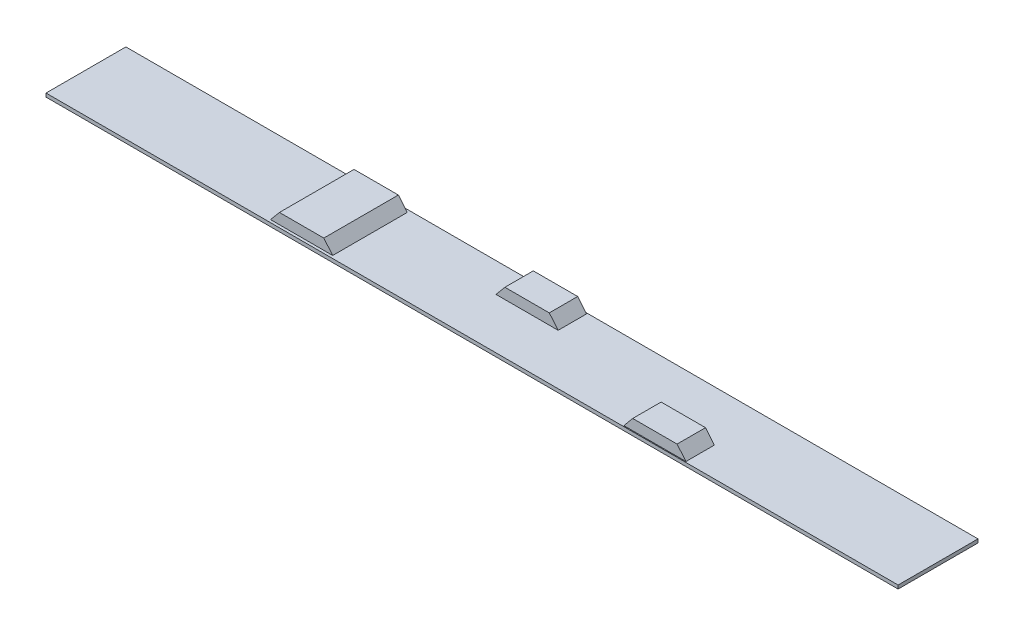
ISO-10303-21;
HEADER;
FILE_DESCRIPTION(('STEP AP214'),'2;1');
FILE_NAME('part.step','',(''),(''),'','','');
FILE_SCHEMA(('AUTOMOTIVE_DESIGN { 1 0 10303 214 1 1 1 1 }'));
ENDSEC;
DATA;
#1=APPLICATION_CONTEXT('core data for automotive mechanical design processes');
#2=APPLICATION_PROTOCOL_DEFINITION('international standard','automotive_design',2000,#1);
#3=PRODUCT_CONTEXT('',#1,'mechanical');
#4=PRODUCT('Part','Part','',(#3));
#5=PRODUCT_RELATED_PRODUCT_CATEGORY('part','',(#4));
#6=PRODUCT_DEFINITION_FORMATION('','',#4);
#7=PRODUCT_DEFINITION_CONTEXT('part definition',#1,'design');
#8=PRODUCT_DEFINITION('design','',#6,#7);
#9=PRODUCT_DEFINITION_SHAPE('','',#8);
#10=(LENGTH_UNIT() NAMED_UNIT(*) SI_UNIT(.MILLI.,.METRE.));
#11=(NAMED_UNIT(*) PLANE_ANGLE_UNIT() SI_UNIT($,.RADIAN.));
#12=(NAMED_UNIT(*) SI_UNIT($,.STERADIAN.) SOLID_ANGLE_UNIT());
#13=UNCERTAINTY_MEASURE_WITH_UNIT(LENGTH_MEASURE(1.E-05),#10,'distance_accuracy_value','');
#14=(GEOMETRIC_REPRESENTATION_CONTEXT(3) GLOBAL_UNCERTAINTY_ASSIGNED_CONTEXT((#13)) GLOBAL_UNIT_ASSIGNED_CONTEXT((#10,
#11,#12)) REPRESENTATION_CONTEXT('',''));
#15=CARTESIAN_POINT('',(0.,0.,0.));
#16=DIRECTION('',(0.,0.,1.));
#17=DIRECTION('',(1.,0.,0.));
#18=AXIS2_PLACEMENT_3D('',#15,#16,#17);
#19=CARTESIAN_POINT('',(0.,10.,0.));
#20=DIRECTION('',(0.,-1.,0.));
#21=DIRECTION('',(0.,0.,-1.));
#22=AXIS2_PLACEMENT_3D('',#19,#20,#21);
#23=PLANE('',#22);
#24=DIRECTION('',(1.,0.,0.));
#25=VECTOR('',#24,1.);
#26=CARTESIAN_POINT('',(425.,10.,110.));
#27=LINE('',#26,#25);
#28=CARTESIAN_POINT('',(425.,10.,110.));
#29=VERTEX_POINT('',#28);
#30=CARTESIAN_POINT('',(600.,10.0000000000001,110.));
#31=VERTEX_POINT('',#30);
#32=EDGE_CURVE('E214',#29,#31,#27,.T.);
#33=ORIENTED_EDGE('',*,*,#32,.F.);
#34=DIRECTION('',(0.,0.,-1.));
#35=VECTOR('',#34,1.);
#36=CARTESIAN_POINT('',(425.,10.,110.));
#37=LINE('',#36,#35);
#38=CARTESIAN_POINT('',(425.,10.,30.));
#39=VERTEX_POINT('',#38);
#40=EDGE_CURVE('E224',#29,#39,#37,.T.);
#41=ORIENTED_EDGE('',*,*,#40,.T.);
#42=DIRECTION('',(1.,0.,0.));
#43=VECTOR('',#42,1.);
#44=CARTESIAN_POINT('',(425.,10.,30.));
#45=LINE('',#44,#43);
#46=CARTESIAN_POINT('',(600.,10.,30.));
#47=VERTEX_POINT('',#46);
#48=EDGE_CURVE('E213',#39,#47,#45,.T.);
#49=ORIENTED_EDGE('',*,*,#48,.T.);
#50=DIRECTION('',(0.,0.,-1.));
#51=VECTOR('',#50,1.);
#52=CARTESIAN_POINT('',(600.,10.0000000000001,110.));
#53=LINE('',#52,#51);
#54=EDGE_CURVE('E240',#31,#47,#53,.T.);
#55=ORIENTED_EDGE('',*,*,#54,.F.);
#56=EDGE_LOOP('',(#33,#41,#49,#55));
#57=FACE_BOUND('',#56,.T.);
#58=DIRECTION('',(0.,0.,-1.));
#59=VECTOR('',#58,1.);
#60=CARTESIAN_POINT('',(1200.,10.,112.5));
#61=LINE('',#60,#59);
#62=CARTESIAN_POINT('',(1200.,10.,112.5));
#63=VERTEX_POINT('',#62);
#64=CARTESIAN_POINT('',(1200.,10.,-112.5));
#65=VERTEX_POINT('',#64);
#66=EDGE_CURVE('E243',#63,#65,#61,.T.);
#67=ORIENTED_EDGE('',*,*,#66,.T.);
#68=DIRECTION('',(-1.,0.,0.));
#69=VECTOR('',#68,1.);
#70=CARTESIAN_POINT('',(-1200.,10.,-112.5));
#71=LINE('',#70,#69);
#72=CARTESIAN_POINT('',(-1200.,10.,-112.5));
#73=VERTEX_POINT('',#72);
#74=EDGE_CURVE('E246',#65,#73,#71,.T.);
#75=ORIENTED_EDGE('',*,*,#74,.T.);
#76=DIRECTION('',(0.,0.,1.));
#77=VECTOR('',#76,1.);
#78=CARTESIAN_POINT('',(-1200.,10.,112.5));
#79=LINE('',#78,#77);
#80=CARTESIAN_POINT('',(-1200.,10.,112.5));
#81=VERTEX_POINT('',#80);
#82=EDGE_CURVE('E249',#73,#81,#79,.T.);
#83=ORIENTED_EDGE('',*,*,#82,.T.);
#84=DIRECTION('',(1.,0.,0.));
#85=VECTOR('',#84,1.);
#86=CARTESIAN_POINT('',(-1200.,10.,112.5));
#87=LINE('',#86,#85);
#88=EDGE_CURVE('E251',#81,#63,#87,.T.);
#89=ORIENTED_EDGE('',*,*,#88,.T.);
#90=EDGE_LOOP('',(#67,#75,#83,#89));
#91=FACE_BOUND('',#90,.T.);
#92=DIRECTION('',(0.,0.,-1.));
#93=VECTOR('',#92,1.);
#94=CARTESIAN_POINT('',(99.9999999999999,9.99999999999662,-30.));
#95=LINE('',#94,#93);
#96=CARTESIAN_POINT('',(99.999999999997,10.,-30.));
#97=VERTEX_POINT('',#96);
#98=CARTESIAN_POINT('',(99.9999999999999,10.,-110.));
#99=VERTEX_POINT('',#98);
#100=EDGE_CURVE('E56',#97,#99,#95,.T.);
#101=ORIENTED_EDGE('',*,*,#100,.F.);
#102=DIRECTION('',(1.,0.,0.));
#103=VECTOR('',#102,1.);
#104=CARTESIAN_POINT('',(-75.0000000000001,9.99999999999653,-30.));
#105=LINE('',#104,#103);
#106=CARTESIAN_POINT('',(-74.9999999999972,10.,-30.));
#107=VERTEX_POINT('',#106);
#108=EDGE_CURVE('E186',#107,#97,#105,.T.);
#109=ORIENTED_EDGE('',*,*,#108,.F.);
#110=DIRECTION('',(0.,0.,-1.));
#111=VECTOR('',#110,1.);
#112=CARTESIAN_POINT('',(-75.0000000000001,9.99999999999653,-30.));
#113=LINE('',#112,#111);
#114=CARTESIAN_POINT('',(-75.0000000000001,9.99999999999653,-110.));
#115=VERTEX_POINT('',#114);
#116=EDGE_CURVE('E197',#107,#115,#113,.T.);
#117=ORIENTED_EDGE('',*,*,#116,.T.);
#118=DIRECTION('',(1.,0.,0.));
#119=VECTOR('',#118,1.);
#120=CARTESIAN_POINT('',(-75.0000000000001,9.99999999999653,-110.));
#121=LINE('',#120,#119);
#122=EDGE_CURVE('E181',#115,#99,#121,.T.);
#123=ORIENTED_EDGE('',*,*,#122,.T.);
#124=EDGE_LOOP('',(#101,#109,#117,#123));
#125=FACE_BOUND('',#124,.T.);
#126=DIRECTION('',(1.,0.,0.));
#127=VECTOR('',#126,1.);
#128=CARTESIAN_POINT('',(-575.,9.99999999999304,-105.));
#129=LINE('',#128,#127);
#130=CARTESIAN_POINT('',(-575.,9.99999999999304,-105.));
#131=VERTEX_POINT('',#130);
#132=CARTESIAN_POINT('',(-400.,9.99999999999313,-105.));
#133=VERTEX_POINT('',#132);
#134=EDGE_CURVE('E174',#131,#133,#129,.T.);
#135=ORIENTED_EDGE('',*,*,#134,.T.);
#136=DIRECTION('',(0.,0.,1.));
#137=VECTOR('',#136,1.);
#138=CARTESIAN_POINT('',(-400.,9.99999999999313,-105.));
#139=LINE('',#138,#137);
#140=CARTESIAN_POINT('',(-400.,9.99999999999313,105.));
#141=VERTEX_POINT('',#140);
#142=EDGE_CURVE('E182',#133,#141,#139,.T.);
#143=ORIENTED_EDGE('',*,*,#142,.T.);
#144=DIRECTION('',(1.,0.,0.));
#145=VECTOR('',#144,1.);
#146=CARTESIAN_POINT('',(-575.,9.99999999999304,105.));
#147=LINE('',#146,#145);
#148=CARTESIAN_POINT('',(-575.,10.,105.));
#149=VERTEX_POINT('',#148);
#150=EDGE_CURVE('E161',#149,#141,#147,.T.);
#151=ORIENTED_EDGE('',*,*,#150,.F.);
#152=DIRECTION('',(0.,0.,1.));
#153=VECTOR('',#152,1.);
#154=CARTESIAN_POINT('',(-575.,9.99999999999304,-105.));
#155=LINE('',#154,#153);
#156=EDGE_CURVE('E155',#131,#149,#155,.T.);
#157=ORIENTED_EDGE('',*,*,#156,.F.);
#158=EDGE_LOOP('',(#135,#143,#151,#157));
#159=FACE_BOUND('',#158,.T.);
#160=ADVANCED_FACE('F33',(#57,#91,#125,#159),#23,.F.);
#161=CARTESIAN_POINT('',(1200.,10.,112.5));
#162=DIRECTION('',(-1.,0.,0.));
#163=DIRECTION('',(0.,0.,1.));
#164=AXIS2_PLACEMENT_3D('',#161,#162,#163);
#165=PLANE('',#164);
#166=DIRECTION('',(0.,0.,-1.));
#167=VECTOR('',#166,1.);
#168=CARTESIAN_POINT('',(1200.,0.,112.5));
#169=LINE('',#168,#167);
#170=CARTESIAN_POINT('',(1200.,0.,112.5));
#171=VERTEX_POINT('',#170);
#172=CARTESIAN_POINT('',(1200.,0.,-112.5));
#173=VERTEX_POINT('',#172);
#174=EDGE_CURVE('E242',#171,#173,#169,.T.);
#175=ORIENTED_EDGE('',*,*,#174,.T.);
#176=DIRECTION('',(0.,-1.,0.));
#177=VECTOR('',#176,1.);
#178=CARTESIAN_POINT('',(1200.,10.,-112.5));
#179=LINE('',#178,#177);
#180=EDGE_CURVE('E11',#65,#173,#179,.T.);
#181=ORIENTED_EDGE('',*,*,#180,.F.);
#182=ORIENTED_EDGE('',*,*,#66,.F.);
#183=DIRECTION('',(0.,-1.,0.));
#184=VECTOR('',#183,1.);
#185=CARTESIAN_POINT('',(1200.,10.,112.5));
#186=LINE('',#185,#184);
#187=EDGE_CURVE('E253',#63,#171,#186,.T.);
#188=ORIENTED_EDGE('',*,*,#187,.T.);
#189=EDGE_LOOP('',(#175,#181,#182,#188));
#190=FACE_BOUND('',#189,.T.);
#191=ADVANCED_FACE('F35',(#190),#165,.F.);
#192=CARTESIAN_POINT('',(-1200.,10.,-112.5));
#193=DIRECTION('',(0.,0.,1.));
#194=DIRECTION('',(1.,0.,0.));
#195=AXIS2_PLACEMENT_3D('',#192,#193,#194);
#196=PLANE('',#195);
#197=DIRECTION('',(-1.,0.,0.));
#198=VECTOR('',#197,1.);
#199=CARTESIAN_POINT('',(-1200.,0.,-112.5));
#200=LINE('',#199,#198);
#201=CARTESIAN_POINT('',(-1200.,0.,-112.5));
#202=VERTEX_POINT('',#201);
#203=EDGE_CURVE('E256',#173,#202,#200,.T.);
#204=ORIENTED_EDGE('',*,*,#203,.T.);
#205=DIRECTION('',(0.,-1.,0.));
#206=VECTOR('',#205,1.);
#207=CARTESIAN_POINT('',(-1200.,10.,-112.5));
#208=LINE('',#207,#206);
#209=EDGE_CURVE('E41',#73,#202,#208,.T.);
#210=ORIENTED_EDGE('',*,*,#209,.F.);
#211=ORIENTED_EDGE('',*,*,#74,.F.);
#212=ORIENTED_EDGE('',*,*,#180,.T.);
#213=EDGE_LOOP('',(#204,#210,#211,#212));
#214=FACE_BOUND('',#213,.T.);
#215=ADVANCED_FACE('F285',(#214),#196,.F.);
#216=CARTESIAN_POINT('',(-1200.,10.,112.5));
#217=DIRECTION('',(1.,0.,0.));
#218=DIRECTION('',(0.,0.,-1.));
#219=AXIS2_PLACEMENT_3D('',#216,#217,#218);
#220=PLANE('',#219);
#221=DIRECTION('',(0.,0.,1.));
#222=VECTOR('',#221,1.);
#223=CARTESIAN_POINT('',(-1200.,0.,112.5));
#224=LINE('',#223,#222);
#225=CARTESIAN_POINT('',(-1200.,0.,112.5));
#226=VERTEX_POINT('',#225);
#227=EDGE_CURVE('E258',#202,#226,#224,.T.);
#228=ORIENTED_EDGE('',*,*,#227,.T.);
#229=DIRECTION('',(0.,-1.,0.));
#230=VECTOR('',#229,1.);
#231=CARTESIAN_POINT('',(-1200.,10.,112.5));
#232=LINE('',#231,#230);
#233=EDGE_CURVE('E263',#81,#226,#232,.T.);
#234=ORIENTED_EDGE('',*,*,#233,.F.);
#235=ORIENTED_EDGE('',*,*,#82,.F.);
#236=ORIENTED_EDGE('',*,*,#209,.T.);
#237=EDGE_LOOP('',(#228,#234,#235,#236));
#238=FACE_BOUND('',#237,.T.);
#239=ADVANCED_FACE('F270',(#238),#220,.F.);
#240=CARTESIAN_POINT('',(-1200.,10.,112.5));
#241=DIRECTION('',(0.,0.,-1.));
#242=DIRECTION('',(-1.,0.,0.));
#243=AXIS2_PLACEMENT_3D('',#240,#241,#242);
#244=PLANE('',#243);
#245=DIRECTION('',(1.,0.,0.));
#246=VECTOR('',#245,1.);
#247=CARTESIAN_POINT('',(-1200.,0.,112.5));
#248=LINE('',#247,#246);
#249=EDGE_CURVE('E247',#226,#171,#248,.T.);
#250=ORIENTED_EDGE('',*,*,#249,.T.);
#251=ORIENTED_EDGE('',*,*,#187,.F.);
#252=ORIENTED_EDGE('',*,*,#88,.F.);
#253=ORIENTED_EDGE('',*,*,#233,.T.);
#254=EDGE_LOOP('',(#250,#251,#252,#253));
#255=FACE_BOUND('',#254,.T.);
#256=ADVANCED_FACE('F279',(#255),#244,.F.);
#257=CARTESIAN_POINT('',(0.,0.,0.));
#258=DIRECTION('',(0.,-1.,0.));
#259=DIRECTION('',(0.,0.,-1.));
#260=AXIS2_PLACEMENT_3D('',#257,#258,#259);
#261=PLANE('',#260);
#262=ORIENTED_EDGE('',*,*,#174,.F.);
#263=ORIENTED_EDGE('',*,*,#249,.F.);
#264=ORIENTED_EDGE('',*,*,#227,.F.);
#265=ORIENTED_EDGE('',*,*,#203,.F.);
#266=EDGE_LOOP('',(#262,#263,#264,#265));
#267=FACE_BOUND('',#266,.T.);
#268=ADVANCED_FACE('F276',(#267),#261,.T.);
#269=CARTESIAN_POINT('',(575.,40.0000000000001,110.));
#270=DIRECTION('',(-0.768221279597375,-0.64018439966448,0.));
#271=DIRECTION('',(0.64018439966448,-0.768221279597375,0.));
#272=AXIS2_PLACEMENT_3D('',#269,#270,#271);
#273=PLANE('',#272);
#274=DIRECTION('',(-0.64018439966448,0.768221279597375,0.));
#275=VECTOR('',#274,1.);
#276=CARTESIAN_POINT('',(575.,40.0000000000001,30.));
#277=LINE('',#276,#275);
#278=CARTESIAN_POINT('',(575.,40.0000000000001,30.));
#279=VERTEX_POINT('',#278);
#280=EDGE_CURVE('E227',#47,#279,#277,.T.);
#281=ORIENTED_EDGE('',*,*,#280,.T.);
#282=DIRECTION('',(0.,0.,-1.));
#283=VECTOR('',#282,1.);
#284=CARTESIAN_POINT('',(575.,40.0000000000001,110.));
#285=LINE('',#284,#283);
#286=CARTESIAN_POINT('',(575.,40.0000000000001,110.));
#287=VERTEX_POINT('',#286);
#288=EDGE_CURVE('E237',#287,#279,#285,.T.);
#289=ORIENTED_EDGE('',*,*,#288,.F.);
#290=DIRECTION('',(-0.64018439966448,0.768221279597375,0.));
#291=VECTOR('',#290,1.);
#292=CARTESIAN_POINT('',(575.,40.0000000000001,110.));
#293=LINE('',#292,#291);
#294=EDGE_CURVE('E217',#31,#287,#293,.T.);
#295=ORIENTED_EDGE('',*,*,#294,.F.);
#296=ORIENTED_EDGE('',*,*,#54,.T.);
#297=EDGE_LOOP('',(#281,#289,#295,#296));
#298=FACE_BOUND('',#297,.T.);
#299=ADVANCED_FACE('F300',(#298),#273,.F.);
#300=CARTESIAN_POINT('',(450.,40.0000000000001,110.));
#301=DIRECTION('',(0.,-1.,0.));
#302=DIRECTION('',(0.,0.,-1.));
#303=AXIS2_PLACEMENT_3D('',#300,#301,#302);
#304=PLANE('',#303);
#305=DIRECTION('',(-1.,0.,0.));
#306=VECTOR('',#305,1.);
#307=CARTESIAN_POINT('',(450.,40.0000000000001,30.));
#308=LINE('',#307,#306);
#309=CARTESIAN_POINT('',(450.,40.0000000000001,30.));
#310=VERTEX_POINT('',#309);
#311=EDGE_CURVE('E229',#279,#310,#308,.T.);
#312=ORIENTED_EDGE('',*,*,#311,.T.);
#313=DIRECTION('',(0.,0.,-1.));
#314=VECTOR('',#313,1.);
#315=CARTESIAN_POINT('',(450.,40.0000000000001,110.));
#316=LINE('',#315,#314);
#317=CARTESIAN_POINT('',(450.,40.0000000000001,110.));
#318=VERTEX_POINT('',#317);
#319=EDGE_CURVE('E234',#318,#310,#316,.T.);
#320=ORIENTED_EDGE('',*,*,#319,.F.);
#321=DIRECTION('',(-1.,0.,0.));
#322=VECTOR('',#321,1.);
#323=CARTESIAN_POINT('',(450.,40.0000000000001,110.));
#324=LINE('',#323,#322);
#325=EDGE_CURVE('E220',#287,#318,#324,.T.);
#326=ORIENTED_EDGE('',*,*,#325,.F.);
#327=ORIENTED_EDGE('',*,*,#288,.T.);
#328=EDGE_LOOP('',(#312,#320,#326,#327));
#329=FACE_BOUND('',#328,.T.);
#330=ADVANCED_FACE('F319',(#329),#304,.F.);
#331=CARTESIAN_POINT('',(425.,10.,110.));
#332=DIRECTION('',(0.768221279597376,-0.640184399664479,0.));
#333=DIRECTION('',(0.640184399664479,0.768221279597376,0.));
#334=AXIS2_PLACEMENT_3D('',#331,#332,#333);
#335=PLANE('',#334);
#336=DIRECTION('',(-0.640184399664479,-0.768221279597376,0.));
#337=VECTOR('',#336,1.);
#338=CARTESIAN_POINT('',(425.,10.,30.));
#339=LINE('',#338,#337);
#340=EDGE_CURVE('E218',#310,#39,#339,.T.);
#341=ORIENTED_EDGE('',*,*,#340,.T.);
#342=ORIENTED_EDGE('',*,*,#40,.F.);
#343=DIRECTION('',(-0.640184399664479,-0.768221279597376,0.));
#344=VECTOR('',#343,1.);
#345=CARTESIAN_POINT('',(425.,10.,110.));
#346=LINE('',#345,#344);
#347=EDGE_CURVE('E222',#318,#29,#346,.T.);
#348=ORIENTED_EDGE('',*,*,#347,.F.);
#349=ORIENTED_EDGE('',*,*,#319,.T.);
#350=EDGE_LOOP('',(#341,#342,#348,#349));
#351=FACE_BOUND('',#350,.T.);
#352=ADVANCED_FACE('F326',(#351),#335,.F.);
#353=CARTESIAN_POINT('',(0.,0.,110.));
#354=DIRECTION('',(0.,0.,-1.));
#355=DIRECTION('',(-1.,0.,0.));
#356=AXIS2_PLACEMENT_3D('',#353,#354,#355);
#357=PLANE('',#356);
#358=ORIENTED_EDGE('',*,*,#32,.T.);
#359=ORIENTED_EDGE('',*,*,#294,.T.);
#360=ORIENTED_EDGE('',*,*,#325,.T.);
#361=ORIENTED_EDGE('',*,*,#347,.T.);
#362=EDGE_LOOP('',(#358,#359,#360,#361));
#363=FACE_BOUND('',#362,.T.);
#364=ADVANCED_FACE('F333',(#363),#357,.F.);
#365=CARTESIAN_POINT('',(0.,0.,30.));
#366=DIRECTION('',(0.,0.,-1.));
#367=DIRECTION('',(-1.,0.,0.));
#368=AXIS2_PLACEMENT_3D('',#365,#366,#367);
#369=PLANE('',#368);
#370=ORIENTED_EDGE('',*,*,#48,.F.);
#371=ORIENTED_EDGE('',*,*,#340,.F.);
#372=ORIENTED_EDGE('',*,*,#311,.F.);
#373=ORIENTED_EDGE('',*,*,#280,.F.);
#374=EDGE_LOOP('',(#370,#371,#372,#373));
#375=FACE_BOUND('',#374,.T.);
#376=ADVANCED_FACE('F341',(#375),#369,.T.);
#377=CARTESIAN_POINT('',(99.9999999999999,9.99999999999662,-30.));
#378=DIRECTION('',(-0.768221279597376,-0.64018439966448,0.));
#379=DIRECTION('',(0.64018439966448,-0.768221279597376,0.));
#380=AXIS2_PLACEMENT_3D('',#377,#378,#379);
#381=PLANE('',#380);
#382=DIRECTION('',(-0.64018439966448,0.768221279597376,0.));
#383=VECTOR('',#382,1.);
#384=CARTESIAN_POINT('',(99.9999999999999,9.99999999999662,-110.));
#385=LINE('',#384,#383);
#386=CARTESIAN_POINT('',(74.9999999999998,39.9999999999966,-110.));
#387=VERTEX_POINT('',#386);
#388=EDGE_CURVE('E199',#99,#387,#385,.T.);
#389=ORIENTED_EDGE('',*,*,#388,.T.);
#390=DIRECTION('',(0.,0.,-1.));
#391=VECTOR('',#390,1.);
#392=CARTESIAN_POINT('',(74.9999999999998,39.9999999999966,-30.));
#393=LINE('',#392,#391);
#394=CARTESIAN_POINT('',(74.9999999999998,39.9999999999966,-30.));
#395=VERTEX_POINT('',#394);
#396=EDGE_CURVE('E209',#395,#387,#393,.T.);
#397=ORIENTED_EDGE('',*,*,#396,.F.);
#398=DIRECTION('',(-0.64018439966448,0.768221279597376,0.));
#399=VECTOR('',#398,1.);
#400=CARTESIAN_POINT('',(99.9999999999999,9.99999999999662,-30.));
#401=LINE('',#400,#399);
#402=EDGE_CURVE('E189',#97,#395,#401,.T.);
#403=ORIENTED_EDGE('',*,*,#402,.F.);
#404=ORIENTED_EDGE('',*,*,#100,.T.);
#405=EDGE_LOOP('',(#389,#397,#403,#404));
#406=FACE_BOUND('',#405,.T.);
#407=ADVANCED_FACE('F349',(#406),#381,.F.);
#408=CARTESIAN_POINT('',(74.9999999999998,39.9999999999966,-30.));
#409=DIRECTION('',(0.,-1.,0.));
#410=DIRECTION('',(0.,0.,-1.));
#411=AXIS2_PLACEMENT_3D('',#408,#409,#410);
#412=PLANE('',#411);
#413=DIRECTION('',(-1.,0.,0.));
#414=VECTOR('',#413,1.);
#415=CARTESIAN_POINT('',(74.9999999999998,39.9999999999966,-110.));
#416=LINE('',#415,#414);
#417=CARTESIAN_POINT('',(-50.0000000000001,39.9999999999966,-110.));
#418=VERTEX_POINT('',#417);
#419=EDGE_CURVE('E201',#387,#418,#416,.T.);
#420=ORIENTED_EDGE('',*,*,#419,.T.);
#421=DIRECTION('',(0.,0.,-1.));
#422=VECTOR('',#421,1.);
#423=CARTESIAN_POINT('',(-50.0000000000001,39.9999999999966,-30.));
#424=LINE('',#423,#422);
#425=CARTESIAN_POINT('',(-50.0000000000001,39.9999999999966,-30.));
#426=VERTEX_POINT('',#425);
#427=EDGE_CURVE('E206',#426,#418,#424,.T.);
#428=ORIENTED_EDGE('',*,*,#427,.F.);
#429=DIRECTION('',(-1.,0.,0.));
#430=VECTOR('',#429,1.);
#431=CARTESIAN_POINT('',(74.9999999999998,39.9999999999966,-30.));
#432=LINE('',#431,#430);
#433=EDGE_CURVE('E192',#395,#426,#432,.T.);
#434=ORIENTED_EDGE('',*,*,#433,.F.);
#435=ORIENTED_EDGE('',*,*,#396,.T.);
#436=EDGE_LOOP('',(#420,#428,#434,#435));
#437=FACE_BOUND('',#436,.T.);
#438=ADVANCED_FACE('F357',(#437),#412,.F.);
#439=CARTESIAN_POINT('',(-50.0000000000001,39.9999999999966,-30.));
#440=DIRECTION('',(0.768221279597376,-0.640184399664479,0.));
#441=DIRECTION('',(0.640184399664479,0.768221279597377,0.));
#442=AXIS2_PLACEMENT_3D('',#439,#440,#441);
#443=PLANE('',#442);
#444=DIRECTION('',(-0.640184399664479,-0.768221279597376,0.));
#445=VECTOR('',#444,1.);
#446=CARTESIAN_POINT('',(-50.0000000000001,39.9999999999966,-110.));
#447=LINE('',#446,#445);
#448=EDGE_CURVE('E190',#418,#115,#447,.T.);
#449=ORIENTED_EDGE('',*,*,#448,.T.);
#450=ORIENTED_EDGE('',*,*,#116,.F.);
#451=DIRECTION('',(-0.640184399664479,-0.768221279597376,0.));
#452=VECTOR('',#451,1.);
#453=CARTESIAN_POINT('',(-50.0000000000001,39.9999999999966,-30.));
#454=LINE('',#453,#452);
#455=EDGE_CURVE('E194',#426,#107,#454,.T.);
#456=ORIENTED_EDGE('',*,*,#455,.F.);
#457=ORIENTED_EDGE('',*,*,#427,.T.);
#458=EDGE_LOOP('',(#449,#450,#456,#457));
#459=FACE_BOUND('',#458,.T.);
#460=ADVANCED_FACE('F365',(#459),#443,.F.);
#461=CARTESIAN_POINT('',(0.,0.,-30.));
#462=DIRECTION('',(0.,0.,1.));
#463=DIRECTION('',(1.,0.,0.));
#464=AXIS2_PLACEMENT_3D('',#461,#462,#463);
#465=PLANE('',#464);
#466=ORIENTED_EDGE('',*,*,#108,.T.);
#467=ORIENTED_EDGE('',*,*,#402,.T.);
#468=ORIENTED_EDGE('',*,*,#433,.T.);
#469=ORIENTED_EDGE('',*,*,#455,.T.);
#470=EDGE_LOOP('',(#466,#467,#468,#469));
#471=FACE_BOUND('',#470,.T.);
#472=ADVANCED_FACE('F373',(#471),#465,.T.);
#473=CARTESIAN_POINT('',(0.,0.,-110.));
#474=DIRECTION('',(0.,0.,1.));
#475=DIRECTION('',(1.,0.,0.));
#476=AXIS2_PLACEMENT_3D('',#473,#474,#475);
#477=PLANE('',#476);
#478=ORIENTED_EDGE('',*,*,#122,.F.);
#479=ORIENTED_EDGE('',*,*,#448,.F.);
#480=ORIENTED_EDGE('',*,*,#419,.F.);
#481=ORIENTED_EDGE('',*,*,#388,.F.);
#482=EDGE_LOOP('',(#478,#479,#480,#481));
#483=FACE_BOUND('',#482,.T.);
#484=ADVANCED_FACE('F381',(#483),#477,.F.);
#485=CARTESIAN_POINT('',(-425.,39.9999999999931,-105.));
#486=DIRECTION('',(0.,1.,0.));
#487=DIRECTION('',(0.,0.,1.));
#488=AXIS2_PLACEMENT_3D('',#485,#486,#487);
#489=PLANE('',#488);
#490=DIRECTION('',(0.,0.,1.));
#491=VECTOR('',#490,1.);
#492=CARTESIAN_POINT('',(-550.,39.9999999999931,-105.));
#493=LINE('',#492,#491);
#494=CARTESIAN_POINT('',(-550.,39.9999999999931,-105.));
#495=VERTEX_POINT('',#494);
#496=CARTESIAN_POINT('',(-550.,39.9999999999931,105.));
#497=VERTEX_POINT('',#496);
#498=EDGE_CURVE('E147',#495,#497,#493,.T.);
#499=ORIENTED_EDGE('',*,*,#498,.T.);
#500=DIRECTION('',(-1.,0.,0.));
#501=VECTOR('',#500,1.);
#502=CARTESIAN_POINT('',(-425.,39.9999999999931,105.));
#503=LINE('',#502,#501);
#504=CARTESIAN_POINT('',(-425.,39.9999999999931,105.));
#505=VERTEX_POINT('',#504);
#506=EDGE_CURVE('E149',#505,#497,#503,.T.);
#507=ORIENTED_EDGE('',*,*,#506,.F.);
#508=DIRECTION('',(0.,0.,1.));
#509=VECTOR('',#508,1.);
#510=CARTESIAN_POINT('',(-425.,39.9999999999931,-105.));
#511=LINE('',#510,#509);
#512=CARTESIAN_POINT('',(-425.,39.9999999999931,-105.));
#513=VERTEX_POINT('',#512);
#514=EDGE_CURVE('E179',#513,#505,#511,.T.);
#515=ORIENTED_EDGE('',*,*,#514,.F.);
#516=DIRECTION('',(-1.,0.,0.));
#517=VECTOR('',#516,1.);
#518=CARTESIAN_POINT('',(-425.,39.9999999999931,-105.));
#519=LINE('',#518,#517);
#520=EDGE_CURVE('E151',#513,#495,#519,.T.);
#521=ORIENTED_EDGE('',*,*,#520,.T.);
#522=EDGE_LOOP('',(#499,#507,#515,#521));
#523=FACE_BOUND('',#522,.T.);
#524=ADVANCED_FACE('F148',(#523),#489,.T.);
#525=CARTESIAN_POINT('',(-400.,9.99999999999313,-105.));
#526=DIRECTION('',(0.768221279597375,0.64018439966448,0.));
#527=DIRECTION('',(-0.64018439966448,0.768221279597376,0.));
#528=AXIS2_PLACEMENT_3D('',#525,#526,#527);
#529=PLANE('',#528);
#530=ORIENTED_EDGE('',*,*,#514,.T.);
#531=DIRECTION('',(-0.64018439966448,0.768221279597375,0.));
#532=VECTOR('',#531,1.);
#533=CARTESIAN_POINT('',(-400.,9.99999999999313,105.));
#534=LINE('',#533,#532);
#535=EDGE_CURVE('E166',#141,#505,#534,.T.);
#536=ORIENTED_EDGE('',*,*,#535,.F.);
#537=ORIENTED_EDGE('',*,*,#142,.F.);
#538=DIRECTION('',(-0.64018439966448,0.768221279597375,0.));
#539=VECTOR('',#538,1.);
#540=CARTESIAN_POINT('',(-400.,9.99999999999313,-105.));
#541=LINE('',#540,#539);
#542=EDGE_CURVE('E156',#133,#513,#541,.T.);
#543=ORIENTED_EDGE('',*,*,#542,.T.);
#544=EDGE_LOOP('',(#530,#536,#537,#543));
#545=FACE_BOUND('',#544,.T.);
#546=ADVANCED_FACE('F396',(#545),#529,.T.);
#547=CARTESIAN_POINT('',(-550.,39.9999999999931,-105.));
#548=DIRECTION('',(-0.768221279597375,0.640184399664481,0.));
#549=DIRECTION('',(-0.640184399664481,-0.768221279597375,0.));
#550=AXIS2_PLACEMENT_3D('',#547,#548,#549);
#551=PLANE('',#550);
#552=ORIENTED_EDGE('',*,*,#156,.T.);
#553=DIRECTION('',(-0.640184399664481,-0.768221279597375,0.));
#554=VECTOR('',#553,1.);
#555=CARTESIAN_POINT('',(-550.,39.9999999999931,105.));
#556=LINE('',#555,#554);
#557=EDGE_CURVE('E48',#497,#149,#556,.T.);
#558=ORIENTED_EDGE('',*,*,#557,.F.);
#559=ORIENTED_EDGE('',*,*,#498,.F.);
#560=DIRECTION('',(-0.640184399664481,-0.768221279597375,0.));
#561=VECTOR('',#560,1.);
#562=CARTESIAN_POINT('',(-550.,39.9999999999931,-105.));
#563=LINE('',#562,#561);
#564=EDGE_CURVE('E172',#495,#131,#563,.T.);
#565=ORIENTED_EDGE('',*,*,#564,.T.);
#566=EDGE_LOOP('',(#552,#558,#559,#565));
#567=FACE_BOUND('',#566,.T.);
#568=ADVANCED_FACE('F158',(#567),#551,.T.);
#569=CARTESIAN_POINT('',(0.,0.,-105.));
#570=DIRECTION('',(0.,0.,1.));
#571=DIRECTION('',(1.,0.,0.));
#572=AXIS2_PLACEMENT_3D('',#569,#570,#571);
#573=PLANE('',#572);
#574=ORIENTED_EDGE('',*,*,#520,.F.);
#575=ORIENTED_EDGE('',*,*,#542,.F.);
#576=ORIENTED_EDGE('',*,*,#134,.F.);
#577=ORIENTED_EDGE('',*,*,#564,.F.);
#578=EDGE_LOOP('',(#574,#575,#576,#577));
#579=FACE_BOUND('',#578,.T.);
#580=ADVANCED_FACE('F410',(#579),#573,.F.);
#581=CARTESIAN_POINT('',(0.,0.,105.));
#582=DIRECTION('',(0.,0.,1.));
#583=DIRECTION('',(1.,0.,0.));
#584=AXIS2_PLACEMENT_3D('',#581,#582,#583);
#585=PLANE('',#584);
#586=ORIENTED_EDGE('',*,*,#506,.T.);
#587=ORIENTED_EDGE('',*,*,#557,.T.);
#588=ORIENTED_EDGE('',*,*,#150,.T.);
#589=ORIENTED_EDGE('',*,*,#535,.T.);
#590=EDGE_LOOP('',(#586,#587,#588,#589));
#591=FACE_BOUND('',#590,.T.);
#592=ADVANCED_FACE('F164',(#591),#585,.T.);
#593=CLOSED_SHELL('',(#160,#191,#215,#239,#256,#268,#299,#330,#352,#364,#376,#407,#438,#460,
#472,#484,#524,#546,#568,#580,#592));
#594=MANIFOLD_SOLID_BREP('B2',#593);
#595=ADVANCED_BREP_SHAPE_REPRESENTATION('',(#18,#594),#14);
#596=SHAPE_DEFINITION_REPRESENTATION(#9,#595);
ENDSEC;
END-ISO-10303-21;
